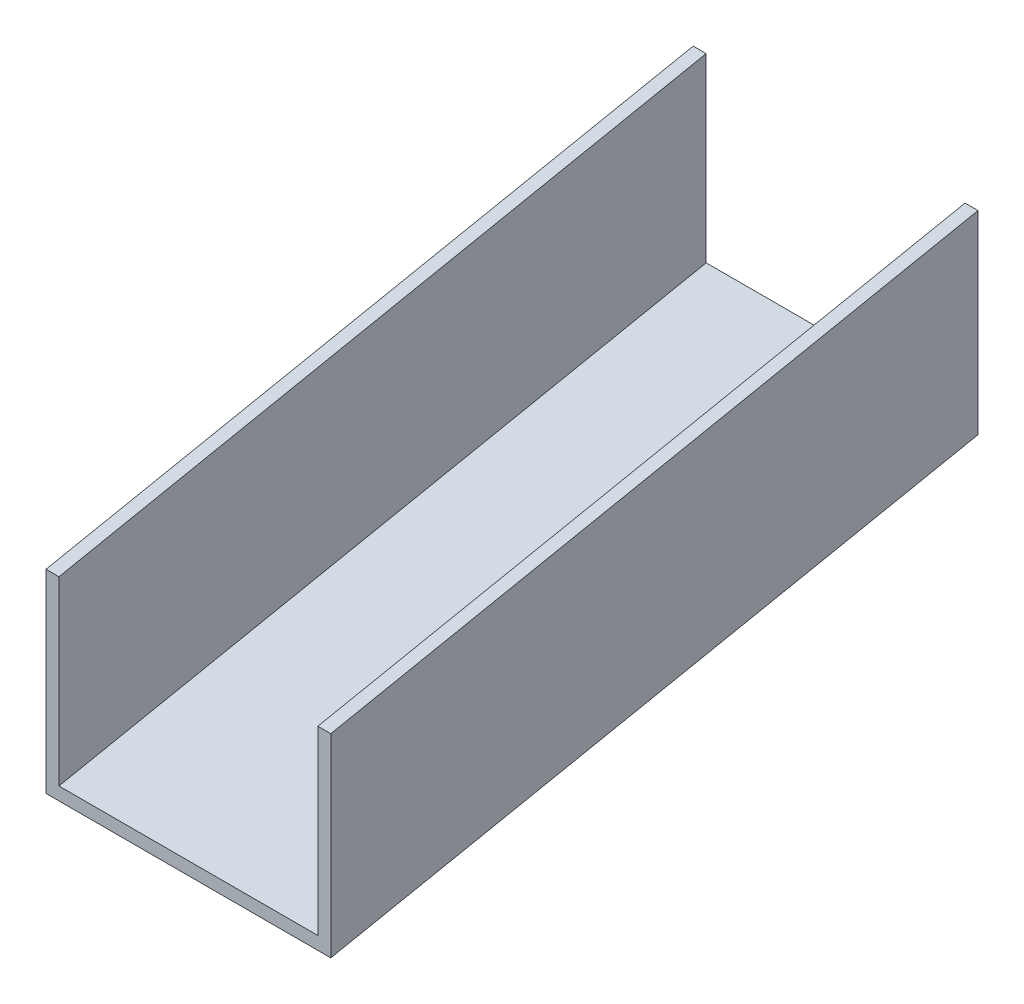
ISO-10303-21;
HEADER;
FILE_DESCRIPTION(('STEP AP214'),'2;1');
FILE_NAME('part.step','',(''),(''),'','','');
FILE_SCHEMA(('AUTOMOTIVE_DESIGN { 1 0 10303 214 1 1 1 1 }'));
ENDSEC;
DATA;
#1=APPLICATION_CONTEXT('core data for automotive mechanical design processes');
#2=APPLICATION_PROTOCOL_DEFINITION('international standard','automotive_design',2000,#1);
#3=PRODUCT_CONTEXT('',#1,'mechanical');
#4=PRODUCT('Part','Part','',(#3));
#5=PRODUCT_RELATED_PRODUCT_CATEGORY('part','',(#4));
#6=PRODUCT_DEFINITION_FORMATION('','',#4);
#7=PRODUCT_DEFINITION_CONTEXT('part definition',#1,'design');
#8=PRODUCT_DEFINITION('design','',#6,#7);
#9=PRODUCT_DEFINITION_SHAPE('','',#8);
#10=(LENGTH_UNIT() NAMED_UNIT(*) SI_UNIT(.MILLI.,.METRE.));
#11=(NAMED_UNIT(*) PLANE_ANGLE_UNIT() SI_UNIT($,.RADIAN.));
#12=(NAMED_UNIT(*) SI_UNIT($,.STERADIAN.) SOLID_ANGLE_UNIT());
#13=UNCERTAINTY_MEASURE_WITH_UNIT(LENGTH_MEASURE(1.E-05),#10,'distance_accuracy_value','');
#14=(GEOMETRIC_REPRESENTATION_CONTEXT(3) GLOBAL_UNCERTAINTY_ASSIGNED_CONTEXT((#13)) GLOBAL_UNIT_ASSIGNED_CONTEXT((#10,
#11,#12)) REPRESENTATION_CONTEXT('',''));
#15=CARTESIAN_POINT('',(0.,0.,0.));
#16=DIRECTION('',(0.,0.,1.));
#17=DIRECTION('',(1.,0.,0.));
#18=AXIS2_PLACEMENT_3D('',#15,#16,#17);
#19=CARTESIAN_POINT('',(0.,0.,0.));
#20=DIRECTION('',(0.,0.,-1.));
#21=DIRECTION('',(-1.,0.,0.));
#22=AXIS2_PLACEMENT_3D('',#19,#20,#21);
#23=PLANE('',#22);
#24=DIRECTION('',(-1.,0.,0.));
#25=VECTOR('',#24,1.);
#26=CARTESIAN_POINT('',(42.,30.,0.));
#27=LINE('',#26,#25);
#28=CARTESIAN_POINT('',(44.,30.,0.));
#29=VERTEX_POINT('',#28);
#30=CARTESIAN_POINT('',(42.,30.,0.));
#31=VERTEX_POINT('',#30);
#32=EDGE_CURVE('E487',#29,#31,#27,.T.);
#33=ORIENTED_EDGE('',*,*,#32,.F.);
#34=DIRECTION('',(0.,1.,0.));
#35=VECTOR('',#34,1.);
#36=CARTESIAN_POINT('',(44.,30.,0.));
#37=LINE('',#36,#35);
#38=CARTESIAN_POINT('',(44.,0.,0.));
#39=VERTEX_POINT('',#38);
#40=EDGE_CURVE('E156',#39,#29,#37,.T.);
#41=ORIENTED_EDGE('',*,*,#40,.F.);
#42=DIRECTION('',(1.,0.,0.));
#43=VECTOR('',#42,1.);
#44=CARTESIAN_POINT('',(44.,0.,0.));
#45=LINE('',#44,#43);
#46=CARTESIAN_POINT('',(0.,0.,0.));
#47=VERTEX_POINT('',#46);
#48=EDGE_CURVE('E200',#47,#39,#45,.T.);
#49=ORIENTED_EDGE('',*,*,#48,.F.);
#50=DIRECTION('',(0.,-1.,0.));
#51=VECTOR('',#50,1.);
#52=CARTESIAN_POINT('',(0.,0.,0.));
#53=LINE('',#52,#51);
#54=CARTESIAN_POINT('',(0.,30.,0.));
#55=VERTEX_POINT('',#54);
#56=EDGE_CURVE('E213',#55,#47,#53,.T.);
#57=ORIENTED_EDGE('',*,*,#56,.F.);
#58=DIRECTION('',(-1.,0.,0.));
#59=VECTOR('',#58,1.);
#60=CARTESIAN_POINT('',(0.,30.,0.));
#61=LINE('',#60,#59);
#62=CARTESIAN_POINT('',(1.99999999999999,30.,0.));
#63=VERTEX_POINT('',#62);
#64=EDGE_CURVE('E383',#63,#55,#61,.T.);
#65=ORIENTED_EDGE('',*,*,#64,.F.);
#66=DIRECTION('',(0.,1.,0.));
#67=VECTOR('',#66,1.);
#68=CARTESIAN_POINT('',(1.99999999999999,30.,0.));
#69=LINE('',#68,#67);
#70=CARTESIAN_POINT('',(2.,2.,0.));
#71=VERTEX_POINT('',#70);
#72=EDGE_CURVE('E390',#71,#63,#69,.T.);
#73=ORIENTED_EDGE('',*,*,#72,.F.);
#74=DIRECTION('',(-1.,0.,0.));
#75=VECTOR('',#74,1.);
#76=CARTESIAN_POINT('',(2.,2.,0.));
#77=LINE('',#76,#75);
#78=CARTESIAN_POINT('',(42.,2.,0.));
#79=VERTEX_POINT('',#78);
#80=EDGE_CURVE('E70',#79,#71,#77,.T.);
#81=ORIENTED_EDGE('',*,*,#80,.F.);
#82=DIRECTION('',(0.,-1.,0.));
#83=VECTOR('',#82,1.);
#84=CARTESIAN_POINT('',(42.,2.,0.));
#85=LINE('',#84,#83);
#86=EDGE_CURVE('E12',#31,#79,#85,.T.);
#87=ORIENTED_EDGE('',*,*,#86,.F.);
#88=EDGE_LOOP('',(#33,#41,#49,#57,#65,#73,#81,#87));
#89=FACE_BOUND('',#88,.T.);
#90=ADVANCED_FACE('F60',(#89),#23,.T.);
#91=CARTESIAN_POINT('',(0.,0.,100.));
#92=DIRECTION('',(0.,0.,-1.));
#93=DIRECTION('',(-1.,0.,0.));
#94=AXIS2_PLACEMENT_3D('',#91,#92,#93);
#95=PLANE('',#94);
#96=DIRECTION('',(-1.,0.,0.));
#97=VECTOR('',#96,1.);
#98=CARTESIAN_POINT('',(42.,10.,100.));
#99=LINE('',#98,#97);
#100=CARTESIAN_POINT('',(44.,10.,100.));
#101=VERTEX_POINT('',#100);
#102=CARTESIAN_POINT('',(42.,10.,100.));
#103=VERTEX_POINT('',#102);
#104=EDGE_CURVE('E128',#101,#103,#99,.T.);
#105=ORIENTED_EDGE('',*,*,#104,.T.);
#106=DIRECTION('',(0.,-1.,0.));
#107=VECTOR('',#106,1.);
#108=CARTESIAN_POINT('',(42.0000000000001,-18.,100.));
#109=LINE('',#108,#107);
#110=CARTESIAN_POINT('',(42.0000000000001,-18.,100.));
#111=VERTEX_POINT('',#110);
#112=EDGE_CURVE('E269',#103,#111,#109,.T.);
#113=ORIENTED_EDGE('',*,*,#112,.T.);
#114=DIRECTION('',(-1.,0.,0.));
#115=VECTOR('',#114,1.);
#116=CARTESIAN_POINT('',(2.00000000000009,-18.,100.));
#117=LINE('',#116,#115);
#118=CARTESIAN_POINT('',(2.00000000000009,-18.,100.));
#119=VERTEX_POINT('',#118);
#120=EDGE_CURVE('E292',#111,#119,#117,.T.);
#121=ORIENTED_EDGE('',*,*,#120,.T.);
#122=DIRECTION('',(0.,1.,0.));
#123=VECTOR('',#122,1.);
#124=CARTESIAN_POINT('',(2.00000000000014,10.,100.));
#125=LINE('',#124,#123);
#126=CARTESIAN_POINT('',(2.00000000000014,10.,100.));
#127=VERTEX_POINT('',#126);
#128=EDGE_CURVE('E280',#119,#127,#125,.T.);
#129=ORIENTED_EDGE('',*,*,#128,.T.);
#130=DIRECTION('',(-1.,0.,0.));
#131=VECTOR('',#130,1.);
#132=CARTESIAN_POINT('',(0.,10.,100.));
#133=LINE('',#132,#131);
#134=CARTESIAN_POINT('',(0.,10.,100.));
#135=VERTEX_POINT('',#134);
#136=EDGE_CURVE('E259',#127,#135,#133,.T.);
#137=ORIENTED_EDGE('',*,*,#136,.T.);
#138=DIRECTION('',(0.,-1.,0.));
#139=VECTOR('',#138,1.);
#140=CARTESIAN_POINT('',(0.,-20.,100.));
#141=LINE('',#140,#139);
#142=CARTESIAN_POINT('',(0.,-20.,100.));
#143=VERTEX_POINT('',#142);
#144=EDGE_CURVE('E376',#135,#143,#141,.T.);
#145=ORIENTED_EDGE('',*,*,#144,.T.);
#146=DIRECTION('',(1.,0.,0.));
#147=VECTOR('',#146,1.);
#148=CARTESIAN_POINT('',(44.0000000000002,-20.,100.));
#149=LINE('',#148,#147);
#150=CARTESIAN_POINT('',(44.0000000000002,-20.,100.));
#151=VERTEX_POINT('',#150);
#152=EDGE_CURVE('E132',#143,#151,#149,.T.);
#153=ORIENTED_EDGE('',*,*,#152,.T.);
#154=DIRECTION('',(0.,1.,0.));
#155=VECTOR('',#154,1.);
#156=CARTESIAN_POINT('',(44.,10.,100.));
#157=LINE('',#156,#155);
#158=EDGE_CURVE('E127',#151,#101,#157,.T.);
#159=ORIENTED_EDGE('',*,*,#158,.T.);
#160=EDGE_LOOP('',(#105,#113,#121,#129,#137,#145,#153,#159));
#161=FACE_BOUND('',#160,.T.);
#162=ADVANCED_FACE('F129',(#161),#95,.F.);
#163=CARTESIAN_POINT('',(0.,28.8461538461539,5.76923076923077));
#164=DIRECTION('',(0.,0.98058067569092,0.196116135138184));
#165=DIRECTION('',(0.,-0.196116135138184,0.98058067569092));
#166=AXIS2_PLACEMENT_3D('',#163,#164,#165);
#167=PLANE('',#166);
#168=DIRECTION('',(0.,0.196116135138184,-0.98058067569092));
#169=VECTOR('',#168,1.);
#170=CARTESIAN_POINT('',(2.00000000000014,10.,100.));
#171=LINE('',#170,#169);
#172=EDGE_CURVE('E253',#127,#63,#171,.T.);
#173=ORIENTED_EDGE('',*,*,#172,.T.);
#174=ORIENTED_EDGE('',*,*,#64,.T.);
#175=DIRECTION('',(0.,0.196116135138184,-0.98058067569092));
#176=VECTOR('',#175,1.);
#177=CARTESIAN_POINT('',(0.,10.,100.));
#178=LINE('',#177,#176);
#179=EDGE_CURVE('E242',#135,#55,#178,.T.);
#180=ORIENTED_EDGE('',*,*,#179,.F.);
#181=ORIENTED_EDGE('',*,*,#136,.F.);
#182=EDGE_LOOP('',(#173,#174,#180,#181));
#183=FACE_BOUND('',#182,.T.);
#184=ADVANCED_FACE('F229',(#183),#167,.T.);
#185=CARTESIAN_POINT('',(0.,0.,0.));
#186=DIRECTION('',(-1.,0.,0.));
#187=DIRECTION('',(0.,0.,1.));
#188=AXIS2_PLACEMENT_3D('',#185,#186,#187);
#189=PLANE('',#188);
#190=ORIENTED_EDGE('',*,*,#179,.T.);
#191=ORIENTED_EDGE('',*,*,#56,.T.);
#192=DIRECTION('',(0.,0.196116135138184,-0.98058067569092));
#193=VECTOR('',#192,1.);
#194=CARTESIAN_POINT('',(0.,-20.,100.));
#195=LINE('',#194,#193);
#196=EDGE_CURVE('E159',#143,#47,#195,.T.);
#197=ORIENTED_EDGE('',*,*,#196,.F.);
#198=ORIENTED_EDGE('',*,*,#144,.F.);
#199=EDGE_LOOP('',(#190,#191,#197,#198));
#200=FACE_BOUND('',#199,.T.);
#201=ADVANCED_FACE('F218',(#200),#189,.T.);
#202=CARTESIAN_POINT('',(2.00000000000001,0.,0.));
#203=DIRECTION('',(1.,0.,0.));
#204=DIRECTION('',(0.,0.,-1.));
#205=AXIS2_PLACEMENT_3D('',#202,#203,#204);
#206=PLANE('',#205);
#207=DIRECTION('',(0.,0.196116135138184,-0.98058067569092));
#208=VECTOR('',#207,1.);
#209=CARTESIAN_POINT('',(2.00000000000009,-18.,100.));
#210=LINE('',#209,#208);
#211=EDGE_CURVE('E246',#119,#71,#210,.T.);
#212=ORIENTED_EDGE('',*,*,#211,.T.);
#213=ORIENTED_EDGE('',*,*,#72,.T.);
#214=ORIENTED_EDGE('',*,*,#172,.F.);
#215=ORIENTED_EDGE('',*,*,#128,.F.);
#216=EDGE_LOOP('',(#212,#213,#214,#215));
#217=FACE_BOUND('',#216,.T.);
#218=ADVANCED_FACE('F228',(#217),#206,.T.);
#219=CARTESIAN_POINT('',(0.,1.92307692307692,0.384615384615384));
#220=DIRECTION('',(0.,0.98058067569092,0.196116135138184));
#221=DIRECTION('',(0.,-0.196116135138184,0.98058067569092));
#222=AXIS2_PLACEMENT_3D('',#219,#220,#221);
#223=PLANE('',#222);
#224=DIRECTION('',(0.,0.196116135138184,-0.98058067569092));
#225=VECTOR('',#224,1.);
#226=CARTESIAN_POINT('',(42.0000000000001,-18.,100.));
#227=LINE('',#226,#225);
#228=EDGE_CURVE('E85',#111,#79,#227,.T.);
#229=ORIENTED_EDGE('',*,*,#228,.T.);
#230=ORIENTED_EDGE('',*,*,#80,.T.);
#231=ORIENTED_EDGE('',*,*,#211,.F.);
#232=ORIENTED_EDGE('',*,*,#120,.F.);
#233=EDGE_LOOP('',(#229,#230,#231,#232));
#234=FACE_BOUND('',#233,.T.);
#235=ADVANCED_FACE('F296',(#234),#223,.T.);
#236=CARTESIAN_POINT('',(42.,0.,0.));
#237=DIRECTION('',(-1.,0.,0.));
#238=DIRECTION('',(0.,-1.,0.));
#239=AXIS2_PLACEMENT_3D('',#236,#237,#238);
#240=PLANE('',#239);
#241=DIRECTION('',(0.,0.196116135138184,-0.98058067569092));
#242=VECTOR('',#241,1.);
#243=CARTESIAN_POINT('',(42.,10.,100.));
#244=LINE('',#243,#242);
#245=EDGE_CURVE('E149',#103,#31,#244,.T.);
#246=ORIENTED_EDGE('',*,*,#245,.T.);
#247=ORIENTED_EDGE('',*,*,#86,.T.);
#248=ORIENTED_EDGE('',*,*,#228,.F.);
#249=ORIENTED_EDGE('',*,*,#112,.F.);
#250=EDGE_LOOP('',(#246,#247,#248,#249));
#251=FACE_BOUND('',#250,.T.);
#252=ADVANCED_FACE('F304',(#251),#240,.T.);
#253=CARTESIAN_POINT('',(0.,28.8461538461539,5.76923076923077));
#254=DIRECTION('',(0.,0.98058067569092,0.196116135138184));
#255=DIRECTION('',(0.,-0.196116135138184,0.98058067569092));
#256=AXIS2_PLACEMENT_3D('',#253,#254,#255);
#257=PLANE('',#256);
#258=DIRECTION('',(0.,0.196116135138184,-0.98058067569092));
#259=VECTOR('',#258,1.);
#260=CARTESIAN_POINT('',(44.,10.,100.));
#261=LINE('',#260,#259);
#262=EDGE_CURVE('E150',#101,#29,#261,.T.);
#263=ORIENTED_EDGE('',*,*,#262,.T.);
#264=ORIENTED_EDGE('',*,*,#32,.T.);
#265=ORIENTED_EDGE('',*,*,#245,.F.);
#266=ORIENTED_EDGE('',*,*,#104,.F.);
#267=EDGE_LOOP('',(#263,#264,#265,#266));
#268=FACE_BOUND('',#267,.T.);
#269=ADVANCED_FACE('F148',(#268),#257,.T.);
#270=CARTESIAN_POINT('',(44.,0.,-1.04823557241692E-13));
#271=DIRECTION('',(1.,0.,0.));
#272=DIRECTION('',(0.,0.,-1.));
#273=AXIS2_PLACEMENT_3D('',#270,#271,#272);
#274=PLANE('',#273);
#275=DIRECTION('',(0.,0.196116135138184,-0.98058067569092));
#276=VECTOR('',#275,1.);
#277=CARTESIAN_POINT('',(44.0000000000002,-20.,100.));
#278=LINE('',#277,#276);
#279=EDGE_CURVE('E158',#151,#39,#278,.T.);
#280=ORIENTED_EDGE('',*,*,#279,.T.);
#281=ORIENTED_EDGE('',*,*,#40,.T.);
#282=ORIENTED_EDGE('',*,*,#262,.F.);
#283=ORIENTED_EDGE('',*,*,#158,.F.);
#284=EDGE_LOOP('',(#280,#281,#282,#283));
#285=FACE_BOUND('',#284,.T.);
#286=ADVANCED_FACE('F152',(#285),#274,.T.);
#287=CARTESIAN_POINT('',(0.,0.,0.));
#288=DIRECTION('',(0.,-0.98058067569092,-0.196116135138184));
#289=DIRECTION('',(0.,0.196116135138184,-0.98058067569092));
#290=AXIS2_PLACEMENT_3D('',#287,#288,#289);
#291=PLANE('',#290);
#292=ORIENTED_EDGE('',*,*,#196,.T.);
#293=ORIENTED_EDGE('',*,*,#48,.T.);
#294=ORIENTED_EDGE('',*,*,#279,.F.);
#295=ORIENTED_EDGE('',*,*,#152,.F.);
#296=EDGE_LOOP('',(#292,#293,#294,#295));
#297=FACE_BOUND('',#296,.T.);
#298=ADVANCED_FACE('F176',(#297),#291,.T.);
#299=CLOSED_SHELL('',(#90,#162,#184,#201,#218,#235,#252,#269,#286,#298));
#300=MANIFOLD_SOLID_BREP('B2',#299);
#301=ADVANCED_BREP_SHAPE_REPRESENTATION('',(#18,#300),#14);
#302=SHAPE_DEFINITION_REPRESENTATION(#9,#301);
ENDSEC;
END-ISO-10303-21;
